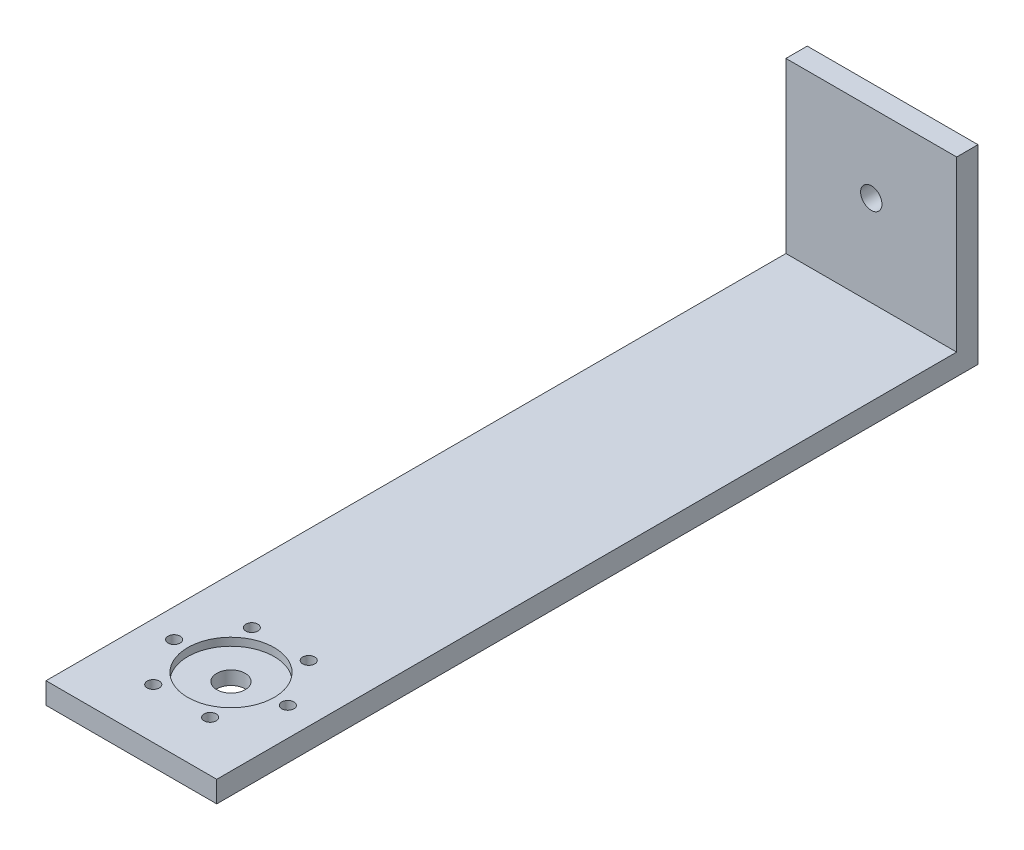
ISO-10303-21;
HEADER;
FILE_DESCRIPTION(('STEP AP214'),'2;1');
FILE_NAME('part.step','',(''),(''),'','','');
FILE_SCHEMA(('AUTOMOTIVE_DESIGN { 1 0 10303 214 1 1 1 1 }'));
ENDSEC;
DATA;
#1=APPLICATION_CONTEXT('core data for automotive mechanical design processes');
#2=APPLICATION_PROTOCOL_DEFINITION('international standard','automotive_design',2000,#1);
#3=PRODUCT_CONTEXT('',#1,'mechanical');
#4=PRODUCT('Part','Part','',(#3));
#5=PRODUCT_RELATED_PRODUCT_CATEGORY('part','',(#4));
#6=PRODUCT_DEFINITION_FORMATION('','',#4);
#7=PRODUCT_DEFINITION_CONTEXT('part definition',#1,'design');
#8=PRODUCT_DEFINITION('design','',#6,#7);
#9=PRODUCT_DEFINITION_SHAPE('','',#8);
#10=(LENGTH_UNIT() NAMED_UNIT(*) SI_UNIT(.MILLI.,.METRE.));
#11=(NAMED_UNIT(*) PLANE_ANGLE_UNIT() SI_UNIT($,.RADIAN.));
#12=(NAMED_UNIT(*) SI_UNIT($,.STERADIAN.) SOLID_ANGLE_UNIT());
#13=UNCERTAINTY_MEASURE_WITH_UNIT(LENGTH_MEASURE(1.E-05),#10,'distance_accuracy_value','');
#14=(GEOMETRIC_REPRESENTATION_CONTEXT(3) GLOBAL_UNCERTAINTY_ASSIGNED_CONTEXT((#13)) GLOBAL_UNIT_ASSIGNED_CONTEXT((#10,
#11,#12)) REPRESENTATION_CONTEXT('',''));
#15=CARTESIAN_POINT('',(0.,0.,0.));
#16=DIRECTION('',(0.,0.,1.));
#17=DIRECTION('',(1.,0.,0.));
#18=AXIS2_PLACEMENT_3D('',#15,#16,#17);
#19=CARTESIAN_POINT('',(0.,-25.5,0.));
#20=DIRECTION('',(0.,-1.,0.));
#21=DIRECTION('',(0.,0.,-1.));
#22=AXIS2_PLACEMENT_3D('',#19,#20,#21);
#23=CYLINDRICAL_SURFACE('',#22,4.);
#24=CARTESIAN_POINT('',(0.,-31.5,0.));
#25=DIRECTION('',(0.,1.,0.));
#26=DIRECTION('',(0.,0.,1.));
#27=AXIS2_PLACEMENT_3D('',#24,#25,#26);
#28=CIRCLE('',#27,4.);
#29=CARTESIAN_POINT('',(0.,-31.5,4.));
#30=VERTEX_POINT('',#29);
#31=EDGE_CURVE('E153',#30,#30,#28,.T.);
#32=ORIENTED_EDGE('',*,*,#31,.F.);
#33=EDGE_LOOP('',(#32));
#34=FACE_BOUND('',#33,.T.);
#35=CARTESIAN_POINT('',(0.,-27.7,0.));
#36=DIRECTION('',(0.,1.,0.));
#37=DIRECTION('',(0.,0.,1.));
#38=AXIS2_PLACEMENT_3D('',#35,#36,#37);
#39=CIRCLE('',#38,4.);
#40=CARTESIAN_POINT('',(0.,-27.7,4.));
#41=VERTEX_POINT('',#40);
#42=EDGE_CURVE('E43',#41,#41,#39,.T.);
#43=ORIENTED_EDGE('',*,*,#42,.T.);
#44=EDGE_LOOP('',(#43));
#45=FACE_BOUND('',#44,.T.);
#46=ADVANCED_FACE('F39',(#34,#45),#23,.F.);
#47=CARTESIAN_POINT('',(0.,-25.5,0.));
#48=DIRECTION('',(0.,1.,0.));
#49=DIRECTION('',(0.,0.,1.));
#50=AXIS2_PLACEMENT_3D('',#47,#48,#49);
#51=PLANE('',#50);
#52=CARTESIAN_POINT('',(0.,-25.5,0.));
#53=DIRECTION('',(0.,1.,0.));
#54=DIRECTION('',(0.,0.,1.));
#55=AXIS2_PLACEMENT_3D('',#52,#53,#54);
#56=CIRCLE('',#55,12.15);
#57=CARTESIAN_POINT('',(0.,-25.5,12.15));
#58=VERTEX_POINT('',#57);
#59=EDGE_CURVE('E158',#58,#58,#56,.T.);
#60=ORIENTED_EDGE('',*,*,#59,.F.);
#61=EDGE_LOOP('',(#60));
#62=FACE_BOUND('',#61,.T.);
#63=CARTESIAN_POINT('',(8.,-25.5,13.856406460551));
#64=DIRECTION('',(0.,1.,0.));
#65=DIRECTION('',(0.,0.,1.));
#66=AXIS2_PLACEMENT_3D('',#63,#64,#65);
#67=CIRCLE('',#66,1.7);
#68=CARTESIAN_POINT('',(8.,-25.5,15.556406460551));
#69=VERTEX_POINT('',#68);
#70=EDGE_CURVE('E150',#69,#69,#67,.T.);
#71=ORIENTED_EDGE('',*,*,#70,.F.);
#72=EDGE_LOOP('',(#71));
#73=FACE_BOUND('',#72,.T.);
#74=CARTESIAN_POINT('',(-16.,-25.5,0.));
#75=DIRECTION('',(0.,1.,0.));
#76=DIRECTION('',(0.,0.,1.));
#77=AXIS2_PLACEMENT_3D('',#74,#75,#76);
#78=CIRCLE('',#77,1.7);
#79=CARTESIAN_POINT('',(-16.,-25.5,1.7));
#80=VERTEX_POINT('',#79);
#81=EDGE_CURVE('E132',#80,#80,#78,.T.);
#82=ORIENTED_EDGE('',*,*,#81,.F.);
#83=EDGE_LOOP('',(#82));
#84=FACE_BOUND('',#83,.T.);
#85=CARTESIAN_POINT('',(8.,-25.5,-13.856406460551));
#86=DIRECTION('',(0.,1.,0.));
#87=DIRECTION('',(0.,0.,1.));
#88=AXIS2_PLACEMENT_3D('',#85,#86,#87);
#89=CIRCLE('',#88,1.7);
#90=CARTESIAN_POINT('',(8.,-25.5,-12.156406460551));
#91=VERTEX_POINT('',#90);
#92=EDGE_CURVE('E121',#91,#91,#89,.T.);
#93=ORIENTED_EDGE('',*,*,#92,.F.);
#94=EDGE_LOOP('',(#93));
#95=FACE_BOUND('',#94,.T.);
#96=DIRECTION('',(0.,0.,1.));
#97=VECTOR('',#96,1.);
#98=CARTESIAN_POINT('',(-24.,-25.5,-180.));
#99=LINE('',#98,#97);
#100=CARTESIAN_POINT('',(-24.,-25.5,-180.));
#101=VERTEX_POINT('',#100);
#102=CARTESIAN_POINT('',(-24.,-25.5,28.));
#103=VERTEX_POINT('',#102);
#104=EDGE_CURVE('E94',#101,#103,#99,.T.);
#105=ORIENTED_EDGE('',*,*,#104,.T.);
#106=DIRECTION('',(1.,0.,0.));
#107=VECTOR('',#106,1.);
#108=CARTESIAN_POINT('',(-24.,-25.5,28.));
#109=LINE('',#108,#107);
#110=CARTESIAN_POINT('',(24.,-25.5,28.));
#111=VERTEX_POINT('',#110);
#112=EDGE_CURVE('E81',#103,#111,#109,.T.);
#113=ORIENTED_EDGE('',*,*,#112,.T.);
#114=DIRECTION('',(0.,0.,-1.));
#115=VECTOR('',#114,1.);
#116=CARTESIAN_POINT('',(24.,-25.5,28.));
#117=LINE('',#116,#115);
#118=CARTESIAN_POINT('',(24.,-25.5,-180.));
#119=VERTEX_POINT('',#118);
#120=EDGE_CURVE('E91',#111,#119,#117,.T.);
#121=ORIENTED_EDGE('',*,*,#120,.T.);
#122=DIRECTION('',(-1.,0.,0.));
#123=VECTOR('',#122,1.);
#124=CARTESIAN_POINT('',(24.,-25.5,-180.));
#125=LINE('',#124,#123);
#126=EDGE_CURVE('E74',#119,#101,#125,.T.);
#127=ORIENTED_EDGE('',*,*,#126,.T.);
#128=EDGE_LOOP('',(#105,#113,#121,#127));
#129=FACE_BOUND('',#128,.T.);
#130=CARTESIAN_POINT('',(16.,-25.5,0.));
#131=DIRECTION('',(0.,1.,0.));
#132=DIRECTION('',(0.,0.,1.));
#133=AXIS2_PLACEMENT_3D('',#130,#131,#132);
#134=CIRCLE('',#133,1.7);
#135=CARTESIAN_POINT('',(16.,-25.5,1.7));
#136=VERTEX_POINT('',#135);
#137=EDGE_CURVE('E109',#136,#136,#134,.T.);
#138=ORIENTED_EDGE('',*,*,#137,.F.);
#139=EDGE_LOOP('',(#138));
#140=FACE_BOUND('',#139,.T.);
#141=CARTESIAN_POINT('',(-8.,-25.5,-13.856406460551));
#142=DIRECTION('',(0.,1.,0.));
#143=DIRECTION('',(0.,0.,1.));
#144=AXIS2_PLACEMENT_3D('',#141,#142,#143);
#145=CIRCLE('',#144,1.7);
#146=CARTESIAN_POINT('',(-8.,-25.5,-12.156406460551));
#147=VERTEX_POINT('',#146);
#148=EDGE_CURVE('E129',#147,#147,#145,.T.);
#149=ORIENTED_EDGE('',*,*,#148,.F.);
#150=EDGE_LOOP('',(#149));
#151=FACE_BOUND('',#150,.T.);
#152=CARTESIAN_POINT('',(-8.00000000000001,-25.5,13.856406460551));
#153=DIRECTION('',(0.,1.,0.));
#154=DIRECTION('',(0.,0.,1.));
#155=AXIS2_PLACEMENT_3D('',#152,#153,#154);
#156=CIRCLE('',#155,1.7);
#157=CARTESIAN_POINT('',(-8.00000000000001,-25.5,15.556406460551));
#158=VERTEX_POINT('',#157);
#159=EDGE_CURVE('E143',#158,#158,#156,.T.);
#160=ORIENTED_EDGE('',*,*,#159,.F.);
#161=EDGE_LOOP('',(#160));
#162=FACE_BOUND('',#161,.T.);
#163=ADVANCED_FACE('F100',(#62,#73,#84,#95,#129,#140,#151,#162),#51,.T.);
#164=CARTESIAN_POINT('',(0.,-31.5,0.));
#165=DIRECTION('',(0.,1.,0.));
#166=DIRECTION('',(0.,0.,1.));
#167=AXIS2_PLACEMENT_3D('',#164,#165,#166);
#168=PLANE('',#167);
#169=DIRECTION('',(0.,0.,1.));
#170=VECTOR('',#169,1.);
#171=CARTESIAN_POINT('',(-24.,-31.5,-180.));
#172=LINE('',#171,#170);
#173=CARTESIAN_POINT('',(-24.,-31.5,-186.));
#174=VERTEX_POINT('',#173);
#175=CARTESIAN_POINT('',(-24.,-31.5,28.));
#176=VERTEX_POINT('',#175);
#177=EDGE_CURVE('E103',#174,#176,#172,.T.);
#178=ORIENTED_EDGE('',*,*,#177,.F.);
#179=DIRECTION('',(1.,0.,0.));
#180=VECTOR('',#179,1.);
#181=CARTESIAN_POINT('',(24.,-31.5,-186.));
#182=LINE('',#181,#180);
#183=CARTESIAN_POINT('',(24.,-31.5,-186.));
#184=VERTEX_POINT('',#183);
#185=EDGE_CURVE('E177',#174,#184,#182,.T.);
#186=ORIENTED_EDGE('',*,*,#185,.T.);
#187=DIRECTION('',(0.,0.,-1.));
#188=VECTOR('',#187,1.);
#189=CARTESIAN_POINT('',(24.,-31.5,28.));
#190=LINE('',#189,#188);
#191=CARTESIAN_POINT('',(24.,-31.5,28.));
#192=VERTEX_POINT('',#191);
#193=EDGE_CURVE('E99',#192,#184,#190,.T.);
#194=ORIENTED_EDGE('',*,*,#193,.F.);
#195=DIRECTION('',(1.,0.,0.));
#196=VECTOR('',#195,1.);
#197=CARTESIAN_POINT('',(-24.,-31.5,28.));
#198=LINE('',#197,#196);
#199=EDGE_CURVE('E68',#176,#192,#198,.T.);
#200=ORIENTED_EDGE('',*,*,#199,.F.);
#201=EDGE_LOOP('',(#178,#186,#194,#200));
#202=FACE_BOUND('',#201,.T.);
#203=CARTESIAN_POINT('',(16.,-31.5,0.));
#204=DIRECTION('',(0.,1.,0.));
#205=DIRECTION('',(0.,0.,1.));
#206=AXIS2_PLACEMENT_3D('',#203,#204,#205);
#207=CIRCLE('',#206,1.7);
#208=CARTESIAN_POINT('',(16.,-31.5,1.7));
#209=VERTEX_POINT('',#208);
#210=EDGE_CURVE('E111',#209,#209,#207,.T.);
#211=ORIENTED_EDGE('',*,*,#210,.T.);
#212=EDGE_LOOP('',(#211));
#213=FACE_BOUND('',#212,.T.);
#214=CARTESIAN_POINT('',(8.,-31.5,-13.856406460551));
#215=DIRECTION('',(0.,1.,0.));
#216=DIRECTION('',(0.,0.,1.));
#217=AXIS2_PLACEMENT_3D('',#214,#215,#216);
#218=CIRCLE('',#217,1.7);
#219=CARTESIAN_POINT('',(8.,-31.5,-12.156406460551));
#220=VERTEX_POINT('',#219);
#221=EDGE_CURVE('E127',#220,#220,#218,.T.);
#222=ORIENTED_EDGE('',*,*,#221,.T.);
#223=EDGE_LOOP('',(#222));
#224=FACE_BOUND('',#223,.T.);
#225=CARTESIAN_POINT('',(-8.,-31.5,-13.856406460551));
#226=DIRECTION('',(0.,1.,0.));
#227=DIRECTION('',(0.,0.,1.));
#228=AXIS2_PLACEMENT_3D('',#225,#226,#227);
#229=CIRCLE('',#228,1.7);
#230=CARTESIAN_POINT('',(-8.,-31.5,-12.156406460551));
#231=VERTEX_POINT('',#230);
#232=EDGE_CURVE('E131',#231,#231,#229,.T.);
#233=ORIENTED_EDGE('',*,*,#232,.T.);
#234=EDGE_LOOP('',(#233));
#235=FACE_BOUND('',#234,.T.);
#236=CARTESIAN_POINT('',(-16.,-31.5,0.));
#237=DIRECTION('',(0.,1.,0.));
#238=DIRECTION('',(0.,0.,1.));
#239=AXIS2_PLACEMENT_3D('',#236,#237,#238);
#240=CIRCLE('',#239,1.7);
#241=CARTESIAN_POINT('',(-16.,-31.5,1.7));
#242=VERTEX_POINT('',#241);
#243=EDGE_CURVE('E139',#242,#242,#240,.T.);
#244=ORIENTED_EDGE('',*,*,#243,.T.);
#245=EDGE_LOOP('',(#244));
#246=FACE_BOUND('',#245,.T.);
#247=CARTESIAN_POINT('',(-8.00000000000001,-31.5,13.856406460551));
#248=DIRECTION('',(0.,1.,0.));
#249=DIRECTION('',(0.,0.,1.));
#250=AXIS2_PLACEMENT_3D('',#247,#248,#249);
#251=CIRCLE('',#250,1.7);
#252=CARTESIAN_POINT('',(-8.00000000000001,-31.5,15.556406460551));
#253=VERTEX_POINT('',#252);
#254=EDGE_CURVE('E145',#253,#253,#251,.T.);
#255=ORIENTED_EDGE('',*,*,#254,.T.);
#256=EDGE_LOOP('',(#255));
#257=FACE_BOUND('',#256,.T.);
#258=CARTESIAN_POINT('',(8.,-31.5,13.856406460551));
#259=DIRECTION('',(0.,1.,0.));
#260=DIRECTION('',(0.,0.,1.));
#261=AXIS2_PLACEMENT_3D('',#258,#259,#260);
#262=CIRCLE('',#261,1.7);
#263=CARTESIAN_POINT('',(8.,-31.5,15.556406460551));
#264=VERTEX_POINT('',#263);
#265=EDGE_CURVE('E147',#264,#264,#262,.T.);
#266=ORIENTED_EDGE('',*,*,#265,.T.);
#267=EDGE_LOOP('',(#266));
#268=FACE_BOUND('',#267,.T.);
#269=ORIENTED_EDGE('',*,*,#31,.T.);
#270=EDGE_LOOP('',(#269));
#271=FACE_BOUND('',#270,.T.);
#272=ADVANCED_FACE('F217',(#202,#213,#224,#235,#246,#257,#268,#271),#168,.F.);
#273=CARTESIAN_POINT('',(-24.,-25.5,-180.));
#274=DIRECTION('',(1.,0.,0.));
#275=DIRECTION('',(0.,0.,-1.));
#276=AXIS2_PLACEMENT_3D('',#273,#274,#275);
#277=PLANE('',#276);
#278=ORIENTED_EDGE('',*,*,#177,.T.);
#279=DIRECTION('',(0.,-1.,0.));
#280=VECTOR('',#279,1.);
#281=CARTESIAN_POINT('',(-24.,-25.5,28.));
#282=LINE('',#281,#280);
#283=EDGE_CURVE('E11',#103,#176,#282,.T.);
#284=ORIENTED_EDGE('',*,*,#283,.F.);
#285=ORIENTED_EDGE('',*,*,#104,.F.);
#286=DIRECTION('',(0.,-1.,0.));
#287=VECTOR('',#286,1.);
#288=CARTESIAN_POINT('',(-24.,-31.5,-180.));
#289=LINE('',#288,#287);
#290=CARTESIAN_POINT('',(-24.,22.,-180.));
#291=VERTEX_POINT('',#290);
#292=EDGE_CURVE('E60',#291,#101,#289,.T.);
#293=ORIENTED_EDGE('',*,*,#292,.F.);
#294=DIRECTION('',(0.,0.,-1.));
#295=VECTOR('',#294,1.);
#296=CARTESIAN_POINT('',(-24.,22.,-180.));
#297=LINE('',#296,#295);
#298=CARTESIAN_POINT('',(-24.,22.,-186.));
#299=VERTEX_POINT('',#298);
#300=EDGE_CURVE('E170',#291,#299,#297,.T.);
#301=ORIENTED_EDGE('',*,*,#300,.T.);
#302=DIRECTION('',(0.,-1.,0.));
#303=VECTOR('',#302,1.);
#304=CARTESIAN_POINT('',(-24.,-31.5,-186.));
#305=LINE('',#304,#303);
#306=EDGE_CURVE('E110',#299,#174,#305,.T.);
#307=ORIENTED_EDGE('',*,*,#306,.T.);
#308=EDGE_LOOP('',(#278,#284,#285,#293,#301,#307));
#309=FACE_BOUND('',#308,.T.);
#310=ADVANCED_FACE('F41',(#309),#277,.F.);
#311=CARTESIAN_POINT('',(-24.,-25.5,28.));
#312=DIRECTION('',(0.,0.,-1.));
#313=DIRECTION('',(-1.,0.,0.));
#314=AXIS2_PLACEMENT_3D('',#311,#312,#313);
#315=PLANE('',#314);
#316=ORIENTED_EDGE('',*,*,#199,.T.);
#317=DIRECTION('',(0.,-1.,0.));
#318=VECTOR('',#317,1.);
#319=CARTESIAN_POINT('',(24.,-25.5,28.));
#320=LINE('',#319,#318);
#321=EDGE_CURVE('E47',#111,#192,#320,.T.);
#322=ORIENTED_EDGE('',*,*,#321,.F.);
#323=ORIENTED_EDGE('',*,*,#112,.F.);
#324=ORIENTED_EDGE('',*,*,#283,.T.);
#325=EDGE_LOOP('',(#316,#322,#323,#324));
#326=FACE_BOUND('',#325,.T.);
#327=ADVANCED_FACE('F88',(#326),#315,.F.);
#328=CARTESIAN_POINT('',(24.,-25.5,28.));
#329=DIRECTION('',(-1.,0.,0.));
#330=DIRECTION('',(0.,0.,1.));
#331=AXIS2_PLACEMENT_3D('',#328,#329,#330);
#332=PLANE('',#331);
#333=ORIENTED_EDGE('',*,*,#193,.T.);
#334=DIRECTION('',(0.,1.,0.));
#335=VECTOR('',#334,1.);
#336=CARTESIAN_POINT('',(24.,22.,-186.));
#337=LINE('',#336,#335);
#338=CARTESIAN_POINT('',(24.,22.,-186.));
#339=VERTEX_POINT('',#338);
#340=EDGE_CURVE('E175',#184,#339,#337,.T.);
#341=ORIENTED_EDGE('',*,*,#340,.T.);
#342=DIRECTION('',(0.,0.,-1.));
#343=VECTOR('',#342,1.);
#344=CARTESIAN_POINT('',(24.,22.,-180.));
#345=LINE('',#344,#343);
#346=CARTESIAN_POINT('',(24.,22.,-180.));
#347=VERTEX_POINT('',#346);
#348=EDGE_CURVE('E165',#347,#339,#345,.T.);
#349=ORIENTED_EDGE('',*,*,#348,.F.);
#350=DIRECTION('',(0.,1.,0.));
#351=VECTOR('',#350,1.);
#352=CARTESIAN_POINT('',(24.,22.,-180.));
#353=LINE('',#352,#351);
#354=EDGE_CURVE('E182',#119,#347,#353,.T.);
#355=ORIENTED_EDGE('',*,*,#354,.F.);
#356=ORIENTED_EDGE('',*,*,#120,.F.);
#357=ORIENTED_EDGE('',*,*,#321,.T.);
#358=EDGE_LOOP('',(#333,#341,#349,#355,#356,#357));
#359=FACE_BOUND('',#358,.T.);
#360=ADVANCED_FACE('F247',(#359),#332,.F.);
#361=CARTESIAN_POINT('',(16.,-25.5,0.));
#362=DIRECTION('',(0.,-1.,0.));
#363=DIRECTION('',(0.,0.,-1.));
#364=AXIS2_PLACEMENT_3D('',#361,#362,#363);
#365=CYLINDRICAL_SURFACE('',#364,1.7);
#366=ORIENTED_EDGE('',*,*,#137,.T.);
#367=EDGE_LOOP('',(#366));
#368=FACE_BOUND('',#367,.T.);
#369=ORIENTED_EDGE('',*,*,#210,.F.);
#370=EDGE_LOOP('',(#369));
#371=FACE_BOUND('',#370,.T.);
#372=ADVANCED_FACE('F245',(#368,#371),#365,.F.);
#373=CARTESIAN_POINT('',(8.,-25.5,-13.856406460551));
#374=DIRECTION('',(0.,-1.,0.));
#375=DIRECTION('',(0.,0.,-1.));
#376=AXIS2_PLACEMENT_3D('',#373,#374,#375);
#377=CYLINDRICAL_SURFACE('',#376,1.7);
#378=ORIENTED_EDGE('',*,*,#92,.T.);
#379=EDGE_LOOP('',(#378));
#380=FACE_BOUND('',#379,.T.);
#381=ORIENTED_EDGE('',*,*,#221,.F.);
#382=EDGE_LOOP('',(#381));
#383=FACE_BOUND('',#382,.T.);
#384=ADVANCED_FACE('F239',(#380,#383),#377,.F.);
#385=CARTESIAN_POINT('',(-8.,-25.5,-13.856406460551));
#386=DIRECTION('',(0.,-1.,0.));
#387=DIRECTION('',(0.,0.,-1.));
#388=AXIS2_PLACEMENT_3D('',#385,#386,#387);
#389=CYLINDRICAL_SURFACE('',#388,1.7);
#390=ORIENTED_EDGE('',*,*,#148,.T.);
#391=EDGE_LOOP('',(#390));
#392=FACE_BOUND('',#391,.T.);
#393=ORIENTED_EDGE('',*,*,#232,.F.);
#394=EDGE_LOOP('',(#393));
#395=FACE_BOUND('',#394,.T.);
#396=ADVANCED_FACE('F233',(#392,#395),#389,.F.);
#397=CARTESIAN_POINT('',(-16.,-25.5,0.));
#398=DIRECTION('',(0.,-1.,0.));
#399=DIRECTION('',(0.,0.,-1.));
#400=AXIS2_PLACEMENT_3D('',#397,#398,#399);
#401=CYLINDRICAL_SURFACE('',#400,1.7);
#402=ORIENTED_EDGE('',*,*,#81,.T.);
#403=EDGE_LOOP('',(#402));
#404=FACE_BOUND('',#403,.T.);
#405=ORIENTED_EDGE('',*,*,#243,.F.);
#406=EDGE_LOOP('',(#405));
#407=FACE_BOUND('',#406,.T.);
#408=ADVANCED_FACE('F232',(#404,#407),#401,.F.);
#409=CARTESIAN_POINT('',(-8.00000000000001,-25.5,13.856406460551));
#410=DIRECTION('',(0.,-1.,0.));
#411=DIRECTION('',(0.,0.,-1.));
#412=AXIS2_PLACEMENT_3D('',#409,#410,#411);
#413=CYLINDRICAL_SURFACE('',#412,1.7);
#414=ORIENTED_EDGE('',*,*,#159,.T.);
#415=EDGE_LOOP('',(#414));
#416=FACE_BOUND('',#415,.T.);
#417=ORIENTED_EDGE('',*,*,#254,.F.);
#418=EDGE_LOOP('',(#417));
#419=FACE_BOUND('',#418,.T.);
#420=ADVANCED_FACE('F226',(#416,#419),#413,.F.);
#421=CARTESIAN_POINT('',(8.,-25.5,13.856406460551));
#422=DIRECTION('',(0.,-1.,0.));
#423=DIRECTION('',(0.,0.,-1.));
#424=AXIS2_PLACEMENT_3D('',#421,#422,#423);
#425=CYLINDRICAL_SURFACE('',#424,1.7);
#426=ORIENTED_EDGE('',*,*,#70,.T.);
#427=EDGE_LOOP('',(#426));
#428=FACE_BOUND('',#427,.T.);
#429=ORIENTED_EDGE('',*,*,#265,.F.);
#430=EDGE_LOOP('',(#429));
#431=FACE_BOUND('',#430,.T.);
#432=ADVANCED_FACE('F223',(#428,#431),#425,.F.);
#433=CARTESIAN_POINT('',(0.,-27.7,0.));
#434=DIRECTION('',(0.,1.,0.));
#435=DIRECTION('',(0.,0.,1.));
#436=AXIS2_PLACEMENT_3D('',#433,#434,#435);
#437=CYLINDRICAL_SURFACE('',#436,12.15);
#438=CARTESIAN_POINT('',(0.,-27.7,0.));
#439=DIRECTION('',(0.,1.,0.));
#440=DIRECTION('',(0.,0.,1.));
#441=AXIS2_PLACEMENT_3D('',#438,#439,#440);
#442=CIRCLE('',#441,12.15);
#443=CARTESIAN_POINT('',(0.,-27.7,12.15));
#444=VERTEX_POINT('',#443);
#445=EDGE_CURVE('E161',#444,#444,#442,.T.);
#446=ORIENTED_EDGE('',*,*,#445,.F.);
#447=EDGE_LOOP('',(#446));
#448=FACE_BOUND('',#447,.T.);
#449=ORIENTED_EDGE('',*,*,#59,.T.);
#450=EDGE_LOOP('',(#449));
#451=FACE_BOUND('',#450,.T.);
#452=ADVANCED_FACE('F206',(#448,#451),#437,.F.);
#453=CARTESIAN_POINT('',(0.,-27.7,0.));
#454=DIRECTION('',(0.,1.,0.));
#455=DIRECTION('',(0.,0.,1.));
#456=AXIS2_PLACEMENT_3D('',#453,#454,#455);
#457=PLANE('',#456);
#458=ORIENTED_EDGE('',*,*,#42,.F.);
#459=EDGE_LOOP('',(#458));
#460=FACE_BOUND('',#459,.T.);
#461=ORIENTED_EDGE('',*,*,#445,.T.);
#462=EDGE_LOOP('',(#461));
#463=FACE_BOUND('',#462,.T.);
#464=ADVANCED_FACE('F198',(#460,#463),#457,.T.);
#465=CARTESIAN_POINT('',(0.,0.,-180.));
#466=DIRECTION('',(0.,0.,-1.));
#467=DIRECTION('',(-1.,0.,0.));
#468=AXIS2_PLACEMENT_3D('',#465,#466,#467);
#469=PLANE('',#468);
#470=ORIENTED_EDGE('',*,*,#126,.F.);
#471=ORIENTED_EDGE('',*,*,#354,.T.);
#472=DIRECTION('',(-1.,0.,0.));
#473=VECTOR('',#472,1.);
#474=CARTESIAN_POINT('',(-24.,22.,-180.));
#475=LINE('',#474,#473);
#476=EDGE_CURVE('E166',#347,#291,#475,.T.);
#477=ORIENTED_EDGE('',*,*,#476,.T.);
#478=ORIENTED_EDGE('',*,*,#292,.T.);
#479=EDGE_LOOP('',(#470,#471,#477,#478));
#480=FACE_BOUND('',#479,.T.);
#481=CARTESIAN_POINT('',(0.,0.,-180.));
#482=DIRECTION('',(0.,0.,1.));
#483=DIRECTION('',(1.,0.,0.));
#484=AXIS2_PLACEMENT_3D('',#481,#482,#483);
#485=CIRCLE('',#484,3.);
#486=CARTESIAN_POINT('',(3.,0.,-180.));
#487=VERTEX_POINT('',#486);
#488=EDGE_CURVE('E176',#487,#487,#485,.T.);
#489=ORIENTED_EDGE('',*,*,#488,.F.);
#490=EDGE_LOOP('',(#489));
#491=FACE_BOUND('',#490,.T.);
#492=ADVANCED_FACE('F194',(#480,#491),#469,.F.);
#493=CARTESIAN_POINT('',(0.,0.,-186.));
#494=DIRECTION('',(0.,0.,-1.));
#495=DIRECTION('',(-1.,0.,0.));
#496=AXIS2_PLACEMENT_3D('',#493,#494,#495);
#497=PLANE('',#496);
#498=ORIENTED_EDGE('',*,*,#306,.F.);
#499=DIRECTION('',(-1.,0.,0.));
#500=VECTOR('',#499,1.);
#501=CARTESIAN_POINT('',(-24.,22.,-186.));
#502=LINE('',#501,#500);
#503=EDGE_CURVE('E168',#339,#299,#502,.T.);
#504=ORIENTED_EDGE('',*,*,#503,.F.);
#505=ORIENTED_EDGE('',*,*,#340,.F.);
#506=ORIENTED_EDGE('',*,*,#185,.F.);
#507=EDGE_LOOP('',(#498,#504,#505,#506));
#508=FACE_BOUND('',#507,.T.);
#509=CARTESIAN_POINT('',(0.,0.,-186.));
#510=DIRECTION('',(0.,0.,1.));
#511=DIRECTION('',(1.,0.,0.));
#512=AXIS2_PLACEMENT_3D('',#509,#510,#511);
#513=CIRCLE('',#512,3.);
#514=CARTESIAN_POINT('',(3.,0.,-186.));
#515=VERTEX_POINT('',#514);
#516=EDGE_CURVE('E184',#515,#515,#513,.T.);
#517=ORIENTED_EDGE('',*,*,#516,.T.);
#518=EDGE_LOOP('',(#517));
#519=FACE_BOUND('',#518,.T.);
#520=ADVANCED_FACE('F193',(#508,#519),#497,.T.);
#521=CARTESIAN_POINT('',(-24.,22.,-180.));
#522=DIRECTION('',(0.,-1.,0.));
#523=DIRECTION('',(0.,0.,-1.));
#524=AXIS2_PLACEMENT_3D('',#521,#522,#523);
#525=PLANE('',#524);
#526=ORIENTED_EDGE('',*,*,#503,.T.);
#527=ORIENTED_EDGE('',*,*,#300,.F.);
#528=ORIENTED_EDGE('',*,*,#476,.F.);
#529=ORIENTED_EDGE('',*,*,#348,.T.);
#530=EDGE_LOOP('',(#526,#527,#528,#529));
#531=FACE_BOUND('',#530,.T.);
#532=ADVANCED_FACE('F205',(#531),#525,.F.);
#533=CARTESIAN_POINT('',(0.,0.,-180.));
#534=DIRECTION('',(0.,0.,-1.));
#535=DIRECTION('',(-1.,0.,0.));
#536=AXIS2_PLACEMENT_3D('',#533,#534,#535);
#537=CYLINDRICAL_SURFACE('',#536,3.);
#538=ORIENTED_EDGE('',*,*,#488,.T.);
#539=EDGE_LOOP('',(#538));
#540=FACE_BOUND('',#539,.T.);
#541=ORIENTED_EDGE('',*,*,#516,.F.);
#542=EDGE_LOOP('',(#541));
#543=FACE_BOUND('',#542,.T.);
#544=ADVANCED_FACE('F187',(#540,#543),#537,.F.);
#545=CLOSED_SHELL('',(#46,#163,#272,#310,#327,#360,#372,#384,#396,#408,#420,#432,#452,#464,#492,
#520,#532,#544));
#546=MANIFOLD_SOLID_BREP('B2',#545);
#547=ADVANCED_BREP_SHAPE_REPRESENTATION('',(#18,#546),#14);
#548=SHAPE_DEFINITION_REPRESENTATION(#9,#547);
ENDSEC;
END-ISO-10303-21;
